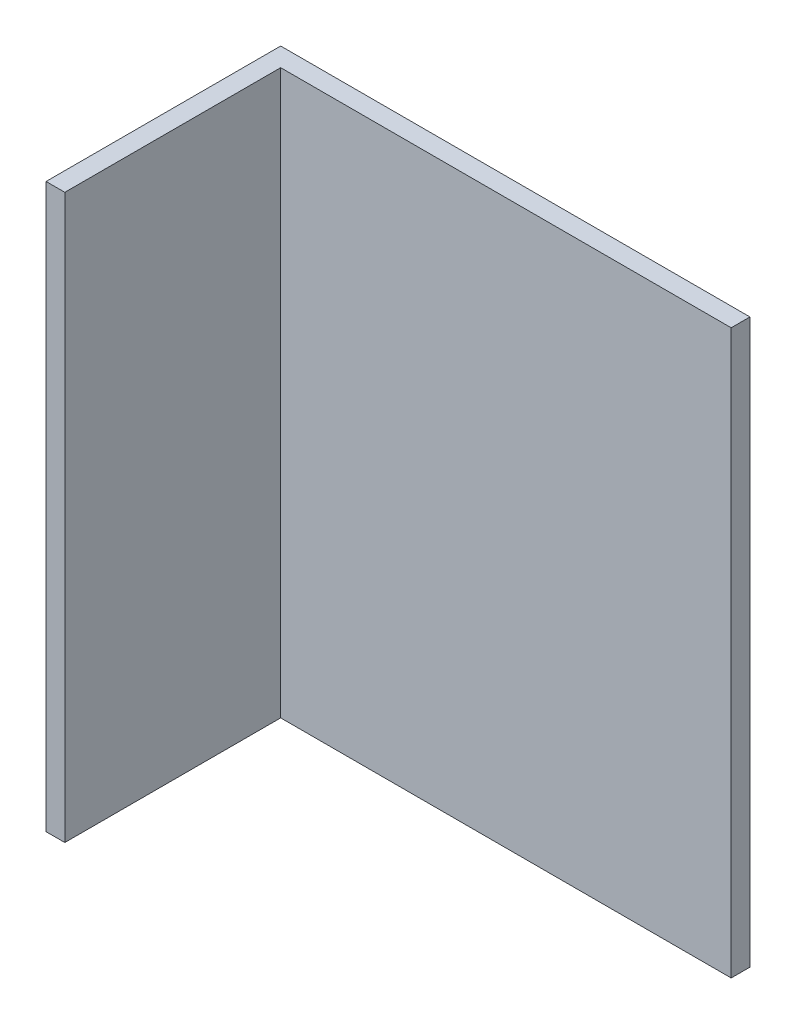
ISO-10303-21;
HEADER;
FILE_DESCRIPTION(('STEP AP214'),'2;1');
FILE_NAME('part.step','',(''),(''),'','','');
FILE_SCHEMA(('AUTOMOTIVE_DESIGN { 1 0 10303 214 1 1 1 1 }'));
ENDSEC;
DATA;
#1=APPLICATION_CONTEXT('core data for automotive mechanical design processes');
#2=APPLICATION_PROTOCOL_DEFINITION('international standard','automotive_design',2000,#1);
#3=PRODUCT_CONTEXT('',#1,'mechanical');
#4=PRODUCT('Part','Part','',(#3));
#5=PRODUCT_RELATED_PRODUCT_CATEGORY('part','',(#4));
#6=PRODUCT_DEFINITION_FORMATION('','',#4);
#7=PRODUCT_DEFINITION_CONTEXT('part definition',#1,'design');
#8=PRODUCT_DEFINITION('design','',#6,#7);
#9=PRODUCT_DEFINITION_SHAPE('','',#8);
#10=(LENGTH_UNIT() NAMED_UNIT(*) SI_UNIT(.MILLI.,.METRE.));
#11=(NAMED_UNIT(*) PLANE_ANGLE_UNIT() SI_UNIT($,.RADIAN.));
#12=(NAMED_UNIT(*) SI_UNIT($,.STERADIAN.) SOLID_ANGLE_UNIT());
#13=UNCERTAINTY_MEASURE_WITH_UNIT(LENGTH_MEASURE(1.E-05),#10,'distance_accuracy_value','');
#14=(GEOMETRIC_REPRESENTATION_CONTEXT(3) GLOBAL_UNCERTAINTY_ASSIGNED_CONTEXT((#13)) GLOBAL_UNIT_ASSIGNED_CONTEXT((#10,
#11,#12)) REPRESENTATION_CONTEXT('',''));
#15=CARTESIAN_POINT('',(0.,0.,0.));
#16=DIRECTION('',(0.,0.,1.));
#17=DIRECTION('',(1.,0.,0.));
#18=AXIS2_PLACEMENT_3D('',#15,#16,#17);
#19=CARTESIAN_POINT('',(0.,240.,8.));
#20=DIRECTION('',(0.,0.,-1.));
#21=DIRECTION('',(-1.,0.,0.));
#22=AXIS2_PLACEMENT_3D('',#19,#20,#21);
#23=PLANE('',#22);
#24=DIRECTION('',(0.,1.,0.));
#25=VECTOR('',#24,1.);
#26=CARTESIAN_POINT('',(8.,240.,8.));
#27=LINE('',#26,#25);
#28=CARTESIAN_POINT('',(8.00000000000001,0.,8.));
#29=VERTEX_POINT('',#28);
#30=CARTESIAN_POINT('',(8.,240.,8.));
#31=VERTEX_POINT('',#30);
#32=EDGE_CURVE('E49',#29,#31,#27,.T.);
#33=ORIENTED_EDGE('',*,*,#32,.F.);
#34=DIRECTION('',(1.,0.,0.));
#35=VECTOR('',#34,1.);
#36=CARTESIAN_POINT('',(0.,0.,8.));
#37=LINE('',#36,#35);
#38=CARTESIAN_POINT('',(200.,0.,8.));
#39=VERTEX_POINT('',#38);
#40=EDGE_CURVE('E94',#29,#39,#37,.T.);
#41=ORIENTED_EDGE('',*,*,#40,.T.);
#42=DIRECTION('',(0.,1.,0.));
#43=VECTOR('',#42,1.);
#44=CARTESIAN_POINT('',(200.,0.,8.));
#45=LINE('',#44,#43);
#46=CARTESIAN_POINT('',(200.,240.,8.));
#47=VERTEX_POINT('',#46);
#48=EDGE_CURVE('E55',#39,#47,#45,.T.);
#49=ORIENTED_EDGE('',*,*,#48,.T.);
#50=DIRECTION('',(-1.,0.,0.));
#51=VECTOR('',#50,1.);
#52=CARTESIAN_POINT('',(0.,240.,8.));
#53=LINE('',#52,#51);
#54=EDGE_CURVE('E85',#47,#31,#53,.T.);
#55=ORIENTED_EDGE('',*,*,#54,.T.);
#56=EDGE_LOOP('',(#33,#41,#49,#55));
#57=FACE_BOUND('',#56,.T.);
#58=ADVANCED_FACE('F32',(#57),#23,.F.);
#59=CARTESIAN_POINT('',(0.,240.,0.));
#60=DIRECTION('',(0.,0.,-1.));
#61=DIRECTION('',(-1.,0.,0.));
#62=AXIS2_PLACEMENT_3D('',#59,#60,#61);
#63=PLANE('',#62);
#64=DIRECTION('',(0.,-1.,0.));
#65=VECTOR('',#64,1.);
#66=CARTESIAN_POINT('',(0.,0.,0.));
#67=LINE('',#66,#65);
#68=CARTESIAN_POINT('',(0.,240.,0.));
#69=VERTEX_POINT('',#68);
#70=CARTESIAN_POINT('',(0.,0.,0.));
#71=VERTEX_POINT('',#70);
#72=EDGE_CURVE('E78',#69,#71,#67,.T.);
#73=ORIENTED_EDGE('',*,*,#72,.F.);
#74=DIRECTION('',(-1.,0.,0.));
#75=VECTOR('',#74,1.);
#76=CARTESIAN_POINT('',(0.,240.,0.));
#77=LINE('',#76,#75);
#78=CARTESIAN_POINT('',(200.,240.,0.));
#79=VERTEX_POINT('',#78);
#80=EDGE_CURVE('E89',#79,#69,#77,.T.);
#81=ORIENTED_EDGE('',*,*,#80,.F.);
#82=DIRECTION('',(0.,1.,0.));
#83=VECTOR('',#82,1.);
#84=CARTESIAN_POINT('',(200.,0.,0.));
#85=LINE('',#84,#83);
#86=CARTESIAN_POINT('',(200.,0.,0.));
#87=VERTEX_POINT('',#86);
#88=EDGE_CURVE('E95',#87,#79,#85,.T.);
#89=ORIENTED_EDGE('',*,*,#88,.F.);
#90=DIRECTION('',(1.,0.,0.));
#91=VECTOR('',#90,1.);
#92=CARTESIAN_POINT('',(0.,0.,0.));
#93=LINE('',#92,#91);
#94=EDGE_CURVE('E99',#71,#87,#93,.T.);
#95=ORIENTED_EDGE('',*,*,#94,.F.);
#96=EDGE_LOOP('',(#73,#81,#89,#95));
#97=FACE_BOUND('',#96,.T.);
#98=ADVANCED_FACE('F98',(#97),#63,.T.);
#99=CARTESIAN_POINT('',(0.,0.,8.));
#100=DIRECTION('',(1.,0.,0.));
#101=DIRECTION('',(0.,0.,-1.));
#102=AXIS2_PLACEMENT_3D('',#99,#100,#101);
#103=PLANE('',#102);
#104=ORIENTED_EDGE('',*,*,#72,.T.);
#105=DIRECTION('',(0.,0.,-1.));
#106=VECTOR('',#105,1.);
#107=CARTESIAN_POINT('',(0.,0.,8.));
#108=LINE('',#107,#106);
#109=CARTESIAN_POINT('',(0.,0.,100.));
#110=VERTEX_POINT('',#109);
#111=EDGE_CURVE('E11',#110,#71,#108,.T.);
#112=ORIENTED_EDGE('',*,*,#111,.F.);
#113=DIRECTION('',(0.,-1.,0.));
#114=VECTOR('',#113,1.);
#115=CARTESIAN_POINT('',(0.,240.,100.));
#116=LINE('',#115,#114);
#117=CARTESIAN_POINT('',(0.,240.,100.));
#118=VERTEX_POINT('',#117);
#119=EDGE_CURVE('E80',#118,#110,#116,.T.);
#120=ORIENTED_EDGE('',*,*,#119,.F.);
#121=DIRECTION('',(0.,0.,-1.));
#122=VECTOR('',#121,1.);
#123=CARTESIAN_POINT('',(0.,240.,8.));
#124=LINE('',#123,#122);
#125=EDGE_CURVE('E74',#118,#69,#124,.T.);
#126=ORIENTED_EDGE('',*,*,#125,.T.);
#127=EDGE_LOOP('',(#104,#112,#120,#126));
#128=FACE_BOUND('',#127,.T.);
#129=ADVANCED_FACE('F34',(#128),#103,.F.);
#130=CARTESIAN_POINT('',(0.,0.,8.));
#131=DIRECTION('',(0.,1.,0.));
#132=DIRECTION('',(0.,0.,1.));
#133=AXIS2_PLACEMENT_3D('',#130,#131,#132);
#134=PLANE('',#133);
#135=ORIENTED_EDGE('',*,*,#40,.F.);
#136=DIRECTION('',(0.,0.,-1.));
#137=VECTOR('',#136,1.);
#138=CARTESIAN_POINT('',(8.00000000000003,0.,100.));
#139=LINE('',#138,#137);
#140=CARTESIAN_POINT('',(8.00000000000003,0.,100.));
#141=VERTEX_POINT('',#140);
#142=EDGE_CURVE('E100',#141,#29,#139,.T.);
#143=ORIENTED_EDGE('',*,*,#142,.F.);
#144=DIRECTION('',(1.,0.,0.));
#145=VECTOR('',#144,1.);
#146=CARTESIAN_POINT('',(0.,0.,100.));
#147=LINE('',#146,#145);
#148=EDGE_CURVE('E136',#110,#141,#147,.T.);
#149=ORIENTED_EDGE('',*,*,#148,.F.);
#150=ORIENTED_EDGE('',*,*,#111,.T.);
#151=ORIENTED_EDGE('',*,*,#94,.T.);
#152=DIRECTION('',(0.,0.,-1.));
#153=VECTOR('',#152,1.);
#154=CARTESIAN_POINT('',(200.,0.,8.));
#155=LINE('',#154,#153);
#156=EDGE_CURVE('E41',#39,#87,#155,.T.);
#157=ORIENTED_EDGE('',*,*,#156,.F.);
#158=EDGE_LOOP('',(#135,#143,#149,#150,#151,#157));
#159=FACE_BOUND('',#158,.T.);
#160=ADVANCED_FACE('F149',(#159),#134,.F.);
#161=CARTESIAN_POINT('',(200.,0.,8.));
#162=DIRECTION('',(-1.,0.,0.));
#163=DIRECTION('',(0.,0.,1.));
#164=AXIS2_PLACEMENT_3D('',#161,#162,#163);
#165=PLANE('',#164);
#166=ORIENTED_EDGE('',*,*,#88,.T.);
#167=DIRECTION('',(0.,0.,-1.));
#168=VECTOR('',#167,1.);
#169=CARTESIAN_POINT('',(200.,240.,8.));
#170=LINE('',#169,#168);
#171=EDGE_CURVE('E84',#47,#79,#170,.T.);
#172=ORIENTED_EDGE('',*,*,#171,.F.);
#173=ORIENTED_EDGE('',*,*,#48,.F.);
#174=ORIENTED_EDGE('',*,*,#156,.T.);
#175=EDGE_LOOP('',(#166,#172,#173,#174));
#176=FACE_BOUND('',#175,.T.);
#177=ADVANCED_FACE('F152',(#176),#165,.F.);
#178=CARTESIAN_POINT('',(0.,240.,8.));
#179=DIRECTION('',(0.,-1.,0.));
#180=DIRECTION('',(0.,0.,-1.));
#181=AXIS2_PLACEMENT_3D('',#178,#179,#180);
#182=PLANE('',#181);
#183=ORIENTED_EDGE('',*,*,#80,.T.);
#184=ORIENTED_EDGE('',*,*,#125,.F.);
#185=DIRECTION('',(-1.,0.,0.));
#186=VECTOR('',#185,1.);
#187=CARTESIAN_POINT('',(0.,240.,100.));
#188=LINE('',#187,#186);
#189=CARTESIAN_POINT('',(8.,240.,100.));
#190=VERTEX_POINT('',#189);
#191=EDGE_CURVE('E129',#190,#118,#188,.T.);
#192=ORIENTED_EDGE('',*,*,#191,.F.);
#193=DIRECTION('',(0.,0.,-1.));
#194=VECTOR('',#193,1.);
#195=CARTESIAN_POINT('',(8.,240.,100.));
#196=LINE('',#195,#194);
#197=EDGE_CURVE('E104',#190,#31,#196,.T.);
#198=ORIENTED_EDGE('',*,*,#197,.T.);
#199=ORIENTED_EDGE('',*,*,#54,.F.);
#200=ORIENTED_EDGE('',*,*,#171,.T.);
#201=EDGE_LOOP('',(#183,#184,#192,#198,#199,#200));
#202=FACE_BOUND('',#201,.T.);
#203=ADVANCED_FACE('F90',(#202),#182,.F.);
#204=CARTESIAN_POINT('',(8.,240.,100.));
#205=DIRECTION('',(-1.,0.,0.));
#206=DIRECTION('',(0.,-1.,0.));
#207=AXIS2_PLACEMENT_3D('',#204,#205,#206);
#208=PLANE('',#207);
#209=ORIENTED_EDGE('',*,*,#32,.T.);
#210=ORIENTED_EDGE('',*,*,#197,.F.);
#211=DIRECTION('',(0.,1.,0.));
#212=VECTOR('',#211,1.);
#213=CARTESIAN_POINT('',(8.,240.,100.));
#214=LINE('',#213,#212);
#215=EDGE_CURVE('E131',#141,#190,#214,.T.);
#216=ORIENTED_EDGE('',*,*,#215,.F.);
#217=ORIENTED_EDGE('',*,*,#142,.T.);
#218=EDGE_LOOP('',(#209,#210,#216,#217));
#219=FACE_BOUND('',#218,.T.);
#220=ADVANCED_FACE('F125',(#219),#208,.F.);
#221=CARTESIAN_POINT('',(0.,0.,100.));
#222=DIRECTION('',(0.,0.,1.));
#223=DIRECTION('',(1.,0.,0.));
#224=AXIS2_PLACEMENT_3D('',#221,#222,#223);
#225=PLANE('',#224);
#226=ORIENTED_EDGE('',*,*,#119,.T.);
#227=ORIENTED_EDGE('',*,*,#148,.T.);
#228=ORIENTED_EDGE('',*,*,#215,.T.);
#229=ORIENTED_EDGE('',*,*,#191,.T.);
#230=EDGE_LOOP('',(#226,#227,#228,#229));
#231=FACE_BOUND('',#230,.T.);
#232=ADVANCED_FACE('F141',(#231),#225,.T.);
#233=CLOSED_SHELL('',(#58,#98,#129,#160,#177,#203,#220,#232));
#234=MANIFOLD_SOLID_BREP('B2',#233);
#235=ADVANCED_BREP_SHAPE_REPRESENTATION('',(#18,#234),#14);
#236=SHAPE_DEFINITION_REPRESENTATION(#9,#235);
ENDSEC;
END-ISO-10303-21;
